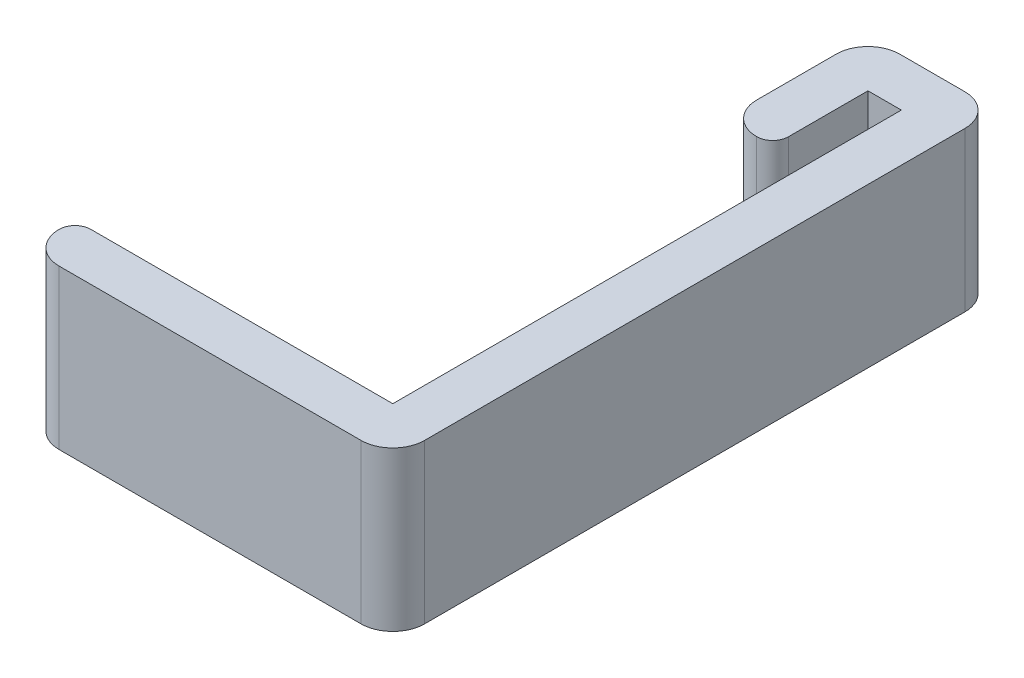
ISO-10303-21;
HEADER;
FILE_DESCRIPTION(('STEP AP214'),'2;1');
FILE_NAME('part.step','',(''),(''),'','','');
FILE_SCHEMA(('AUTOMOTIVE_DESIGN { 1 0 10303 214 1 1 1 1 }'));
ENDSEC;
DATA;
#1=APPLICATION_CONTEXT('core data for automotive mechanical design processes');
#2=APPLICATION_PROTOCOL_DEFINITION('international standard','automotive_design',2000,#1);
#3=PRODUCT_CONTEXT('',#1,'mechanical');
#4=PRODUCT('Part','Part','',(#3));
#5=PRODUCT_RELATED_PRODUCT_CATEGORY('part','',(#4));
#6=PRODUCT_DEFINITION_FORMATION('','',#4);
#7=PRODUCT_DEFINITION_CONTEXT('part definition',#1,'design');
#8=PRODUCT_DEFINITION('design','',#6,#7);
#9=PRODUCT_DEFINITION_SHAPE('','',#8);
#10=(LENGTH_UNIT() NAMED_UNIT(*) SI_UNIT(.MILLI.,.METRE.));
#11=(NAMED_UNIT(*) PLANE_ANGLE_UNIT() SI_UNIT($,.RADIAN.));
#12=(NAMED_UNIT(*) SI_UNIT($,.STERADIAN.) SOLID_ANGLE_UNIT());
#13=UNCERTAINTY_MEASURE_WITH_UNIT(LENGTH_MEASURE(1.E-05),#10,'distance_accuracy_value','');
#14=(GEOMETRIC_REPRESENTATION_CONTEXT(3) GLOBAL_UNCERTAINTY_ASSIGNED_CONTEXT((#13)) GLOBAL_UNIT_ASSIGNED_CONTEXT((#10,
#11,#12)) REPRESENTATION_CONTEXT('',''));
#15=CARTESIAN_POINT('',(0.,0.,0.));
#16=DIRECTION('',(0.,0.,1.));
#17=DIRECTION('',(1.,0.,0.));
#18=AXIS2_PLACEMENT_3D('',#15,#16,#17);
#19=CARTESIAN_POINT('',(-1.,10.,-1.));
#20=DIRECTION('',(0.,1.,0.));
#21=DIRECTION('',(0.,0.,1.));
#22=AXIS2_PLACEMENT_3D('',#19,#20,#21);
#23=CYLINDRICAL_SURFACE('',#22,1.);
#24=DIRECTION('',(0.,-1.,0.));
#25=VECTOR('',#24,1.);
#26=CARTESIAN_POINT('',(-1.,10.,0.));
#27=LINE('',#26,#25);
#28=CARTESIAN_POINT('',(-1.,10.,0.));
#29=VERTEX_POINT('',#28);
#30=CARTESIAN_POINT('',(-1.,0.,0.));
#31=VERTEX_POINT('',#30);
#32=EDGE_CURVE('E243',#29,#31,#27,.T.);
#33=ORIENTED_EDGE('',*,*,#32,.T.);
#34=CARTESIAN_POINT('',(-1.,0.,-1.));
#35=DIRECTION('',(0.,1.,0.));
#36=DIRECTION('',(0.,0.,1.));
#37=AXIS2_PLACEMENT_3D('',#34,#35,#36);
#38=CIRCLE('',#37,1.);
#39=CARTESIAN_POINT('',(0.,0.,-1.));
#40=VERTEX_POINT('',#39);
#41=EDGE_CURVE('E40',#40,#31,#38,.F.);
#42=ORIENTED_EDGE('',*,*,#41,.F.);
#43=DIRECTION('',(0.,1.,0.));
#44=VECTOR('',#43,1.);
#45=CARTESIAN_POINT('',(0.,10.,-1.));
#46=LINE('',#45,#44);
#47=CARTESIAN_POINT('',(0.,10.,-1.));
#48=VERTEX_POINT('',#47);
#49=EDGE_CURVE('E252',#48,#40,#46,.F.);
#50=ORIENTED_EDGE('',*,*,#49,.F.);
#51=CARTESIAN_POINT('',(-1.,10.,-1.));
#52=DIRECTION('',(0.,1.,0.));
#53=DIRECTION('',(0.,0.,1.));
#54=AXIS2_PLACEMENT_3D('',#51,#52,#53);
#55=CIRCLE('',#54,1.);
#56=EDGE_CURVE('E11',#29,#48,#55,.T.);
#57=ORIENTED_EDGE('',*,*,#56,.F.);
#58=EDGE_LOOP('',(#33,#42,#50,#57));
#59=FACE_BOUND('',#58,.T.);
#60=ADVANCED_FACE('F33',(#59),#23,.T.);
#61=CARTESIAN_POINT('',(-1.,10.,-2.));
#62=DIRECTION('',(0.,-1.,0.));
#63=DIRECTION('',(0.,0.,-1.));
#64=AXIS2_PLACEMENT_3D('',#61,#62,#63);
#65=CYLINDRICAL_SURFACE('',#64,2.);
#66=ORIENTED_EDGE('',*,*,#32,.F.);
#67=CARTESIAN_POINT('',(-1.,10.,-2.));
#68=DIRECTION('',(0.,1.,0.));
#69=DIRECTION('',(0.,0.,1.));
#70=AXIS2_PLACEMENT_3D('',#67,#68,#69);
#71=CIRCLE('',#70,2.);
#72=CARTESIAN_POINT('',(-3.,10.,-2.));
#73=VERTEX_POINT('',#72);
#74=EDGE_CURVE('E248',#73,#29,#71,.T.);
#75=ORIENTED_EDGE('',*,*,#74,.F.);
#76=DIRECTION('',(0.,-1.,0.));
#77=VECTOR('',#76,1.);
#78=CARTESIAN_POINT('',(-3.,10.,-2.));
#79=LINE('',#78,#77);
#80=CARTESIAN_POINT('',(-3.,0.,-2.));
#81=VERTEX_POINT('',#80);
#82=EDGE_CURVE('E245',#81,#73,#79,.F.);
#83=ORIENTED_EDGE('',*,*,#82,.F.);
#84=CARTESIAN_POINT('',(-1.,0.,-2.));
#85=DIRECTION('',(0.,1.,0.));
#86=DIRECTION('',(0.,0.,1.));
#87=AXIS2_PLACEMENT_3D('',#84,#85,#86);
#88=CIRCLE('',#87,2.);
#89=EDGE_CURVE('E250',#31,#81,#88,.F.);
#90=ORIENTED_EDGE('',*,*,#89,.F.);
#91=EDGE_LOOP('',(#66,#75,#83,#90));
#92=FACE_BOUND('',#91,.T.);
#93=ADVANCED_FACE('F260',(#92),#65,.T.);
#94=CARTESIAN_POINT('',(-16.9,10.,27.));
#95=DIRECTION('',(0.,-1.,0.));
#96=DIRECTION('',(0.,0.,-1.));
#97=AXIS2_PLACEMENT_3D('',#94,#95,#96);
#98=CYLINDRICAL_SURFACE('',#97,1.);
#99=DIRECTION('',(0.,-1.,0.));
#100=VECTOR('',#99,1.);
#101=CARTESIAN_POINT('',(-17.9,10.,27.));
#102=LINE('',#101,#100);
#103=CARTESIAN_POINT('',(-17.9,0.,27.));
#104=VERTEX_POINT('',#103);
#105=CARTESIAN_POINT('',(-17.9,10.,27.));
#106=VERTEX_POINT('',#105);
#107=EDGE_CURVE('E218',#104,#106,#102,.F.);
#108=ORIENTED_EDGE('',*,*,#107,.T.);
#109=CARTESIAN_POINT('',(-16.9,10.,27.));
#110=DIRECTION('',(0.,1.,0.));
#111=DIRECTION('',(0.,0.,1.));
#112=AXIS2_PLACEMENT_3D('',#109,#110,#111);
#113=CIRCLE('',#112,1.);
#114=CARTESIAN_POINT('',(-16.9,10.,26.));
#115=VERTEX_POINT('',#114);
#116=EDGE_CURVE('E239',#115,#106,#113,.T.);
#117=ORIENTED_EDGE('',*,*,#116,.F.);
#118=DIRECTION('',(0.,-1.,0.));
#119=VECTOR('',#118,1.);
#120=CARTESIAN_POINT('',(-16.9,10.,26.));
#121=LINE('',#120,#119);
#122=CARTESIAN_POINT('',(-16.9,0.,26.));
#123=VERTEX_POINT('',#122);
#124=EDGE_CURVE('E236',#123,#115,#121,.F.);
#125=ORIENTED_EDGE('',*,*,#124,.F.);
#126=CARTESIAN_POINT('',(-16.9,0.,27.));
#127=DIRECTION('',(0.,1.,0.));
#128=DIRECTION('',(0.,0.,1.));
#129=AXIS2_PLACEMENT_3D('',#126,#127,#128);
#130=CIRCLE('',#129,1.);
#131=EDGE_CURVE('E241',#104,#123,#130,.F.);
#132=ORIENTED_EDGE('',*,*,#131,.F.);
#133=EDGE_LOOP('',(#108,#117,#125,#132));
#134=FACE_BOUND('',#133,.T.);
#135=ADVANCED_FACE('F298',(#134),#98,.T.);
#136=CARTESIAN_POINT('',(-1.,10.,-7.));
#137=DIRECTION('',(0.,-1.,0.));
#138=DIRECTION('',(0.,0.,-1.));
#139=AXIS2_PLACEMENT_3D('',#136,#137,#138);
#140=CYLINDRICAL_SURFACE('',#139,2.);
#141=DIRECTION('',(0.,-1.,0.));
#142=VECTOR('',#141,1.);
#143=CARTESIAN_POINT('',(-3.,10.,-7.));
#144=LINE('',#143,#142);
#145=CARTESIAN_POINT('',(-3.,10.,-7.));
#146=VERTEX_POINT('',#145);
#147=CARTESIAN_POINT('',(-3.,0.,-7.));
#148=VERTEX_POINT('',#147);
#149=EDGE_CURVE('E226',#146,#148,#144,.T.);
#150=ORIENTED_EDGE('',*,*,#149,.F.);
#151=CARTESIAN_POINT('',(-1.,10.,-7.));
#152=DIRECTION('',(0.,1.,0.));
#153=DIRECTION('',(0.,0.,1.));
#154=AXIS2_PLACEMENT_3D('',#151,#152,#153);
#155=CIRCLE('',#154,2.);
#156=CARTESIAN_POINT('',(-1.,10.,-9.));
#157=VERTEX_POINT('',#156);
#158=EDGE_CURVE('E232',#157,#146,#155,.T.);
#159=ORIENTED_EDGE('',*,*,#158,.F.);
#160=DIRECTION('',(0.,-1.,0.));
#161=VECTOR('',#160,1.);
#162=CARTESIAN_POINT('',(-1.,10.,-9.));
#163=LINE('',#162,#161);
#164=CARTESIAN_POINT('',(-1.,0.,-9.));
#165=VERTEX_POINT('',#164);
#166=EDGE_CURVE('E229',#165,#157,#163,.F.);
#167=ORIENTED_EDGE('',*,*,#166,.F.);
#168=CARTESIAN_POINT('',(-1.,0.,-7.));
#169=DIRECTION('',(0.,1.,0.));
#170=DIRECTION('',(0.,0.,1.));
#171=AXIS2_PLACEMENT_3D('',#168,#169,#170);
#172=CIRCLE('',#171,2.);
#173=EDGE_CURVE('E234',#148,#165,#172,.F.);
#174=ORIENTED_EDGE('',*,*,#173,.F.);
#175=EDGE_LOOP('',(#150,#159,#167,#174));
#176=FACE_BOUND('',#175,.T.);
#177=ADVANCED_FACE('F268',(#176),#140,.T.);
#178=CARTESIAN_POINT('',(-15.9,10.,27.));
#179=DIRECTION('',(0.,-1.,0.));
#180=DIRECTION('',(0.,0.,-1.));
#181=AXIS2_PLACEMENT_3D('',#178,#179,#180);
#182=CYLINDRICAL_SURFACE('',#181,2.);
#183=DIRECTION('',(0.,-1.,0.));
#184=VECTOR('',#183,1.);
#185=CARTESIAN_POINT('',(-15.9,10.,29.));
#186=LINE('',#185,#184);
#187=CARTESIAN_POINT('',(-15.9,10.,29.));
#188=VERTEX_POINT('',#187);
#189=CARTESIAN_POINT('',(-15.9,0.,29.));
#190=VERTEX_POINT('',#189);
#191=EDGE_CURVE('E215',#188,#190,#186,.T.);
#192=ORIENTED_EDGE('',*,*,#191,.F.);
#193=CARTESIAN_POINT('',(-15.9,10.,27.));
#194=DIRECTION('',(0.,1.,0.));
#195=DIRECTION('',(0.,0.,1.));
#196=AXIS2_PLACEMENT_3D('',#193,#194,#195);
#197=CIRCLE('',#196,2.);
#198=EDGE_CURVE('E221',#106,#188,#197,.T.);
#199=ORIENTED_EDGE('',*,*,#198,.F.);
#200=ORIENTED_EDGE('',*,*,#107,.F.);
#201=CARTESIAN_POINT('',(-15.9,0.,27.));
#202=DIRECTION('',(0.,1.,0.));
#203=DIRECTION('',(0.,0.,1.));
#204=AXIS2_PLACEMENT_3D('',#201,#202,#203);
#205=CIRCLE('',#204,2.);
#206=EDGE_CURVE('E223',#190,#104,#205,.F.);
#207=ORIENTED_EDGE('',*,*,#206,.F.);
#208=EDGE_LOOP('',(#192,#199,#200,#207));
#209=FACE_BOUND('',#208,.T.);
#210=ADVANCED_FACE('F296',(#209),#182,.T.);
#211=CARTESIAN_POINT('',(3.1,10.,27.));
#212=DIRECTION('',(0.,1.,0.));
#213=DIRECTION('',(0.,0.,1.));
#214=AXIS2_PLACEMENT_3D('',#211,#212,#213);
#215=CYLINDRICAL_SURFACE('',#214,2.);
#216=DIRECTION('',(0.,1.,0.));
#217=VECTOR('',#216,1.);
#218=CARTESIAN_POINT('',(3.1,10.,29.));
#219=LINE('',#218,#217);
#220=CARTESIAN_POINT('',(3.1,0.,29.));
#221=VERTEX_POINT('',#220);
#222=CARTESIAN_POINT('',(3.1,10.,29.));
#223=VERTEX_POINT('',#222);
#224=EDGE_CURVE('E204',#221,#223,#219,.T.);
#225=ORIENTED_EDGE('',*,*,#224,.F.);
#226=CARTESIAN_POINT('',(3.1,0.,27.));
#227=DIRECTION('',(0.,1.,0.));
#228=DIRECTION('',(0.,0.,1.));
#229=AXIS2_PLACEMENT_3D('',#226,#227,#228);
#230=CIRCLE('',#229,2.);
#231=CARTESIAN_POINT('',(5.1,0.,27.));
#232=VERTEX_POINT('',#231);
#233=EDGE_CURVE('E210',#232,#221,#230,.F.);
#234=ORIENTED_EDGE('',*,*,#233,.F.);
#235=DIRECTION('',(0.,1.,0.));
#236=VECTOR('',#235,1.);
#237=CARTESIAN_POINT('',(5.1,10.,27.));
#238=LINE('',#237,#236);
#239=CARTESIAN_POINT('',(5.1,10.,27.));
#240=VERTEX_POINT('',#239);
#241=EDGE_CURVE('E207',#240,#232,#238,.F.);
#242=ORIENTED_EDGE('',*,*,#241,.F.);
#243=CARTESIAN_POINT('',(3.1,10.,27.));
#244=DIRECTION('',(0.,1.,0.));
#245=DIRECTION('',(0.,0.,1.));
#246=AXIS2_PLACEMENT_3D('',#243,#244,#245);
#247=CIRCLE('',#246,2.);
#248=EDGE_CURVE('E213',#223,#240,#247,.T.);
#249=ORIENTED_EDGE('',*,*,#248,.F.);
#250=EDGE_LOOP('',(#225,#234,#242,#249));
#251=FACE_BOUND('',#250,.T.);
#252=ADVANCED_FACE('F286',(#251),#215,.T.);
#253=CARTESIAN_POINT('',(3.1,10.,-7.));
#254=DIRECTION('',(0.,-1.,0.));
#255=DIRECTION('',(0.,0.,-1.));
#256=AXIS2_PLACEMENT_3D('',#253,#254,#255);
#257=CYLINDRICAL_SURFACE('',#256,2.);
#258=DIRECTION('',(0.,-1.,0.));
#259=VECTOR('',#258,1.);
#260=CARTESIAN_POINT('',(3.1,10.,-9.));
#261=LINE('',#260,#259);
#262=CARTESIAN_POINT('',(3.1,10.,-9.));
#263=VERTEX_POINT('',#262);
#264=CARTESIAN_POINT('',(3.1,0.,-9.));
#265=VERTEX_POINT('',#264);
#266=EDGE_CURVE('E150',#263,#265,#261,.T.);
#267=ORIENTED_EDGE('',*,*,#266,.F.);
#268=CARTESIAN_POINT('',(3.1,10.,-7.));
#269=DIRECTION('',(0.,1.,0.));
#270=DIRECTION('',(0.,0.,1.));
#271=AXIS2_PLACEMENT_3D('',#268,#269,#270);
#272=CIRCLE('',#271,2.);
#273=CARTESIAN_POINT('',(5.1,10.,-7.));
#274=VERTEX_POINT('',#273);
#275=EDGE_CURVE('E199',#274,#263,#272,.T.);
#276=ORIENTED_EDGE('',*,*,#275,.F.);
#277=DIRECTION('',(0.,-1.,0.));
#278=VECTOR('',#277,1.);
#279=CARTESIAN_POINT('',(5.1,10.,-7.));
#280=LINE('',#279,#278);
#281=CARTESIAN_POINT('',(5.1,0.,-7.));
#282=VERTEX_POINT('',#281);
#283=EDGE_CURVE('E196',#282,#274,#280,.F.);
#284=ORIENTED_EDGE('',*,*,#283,.F.);
#285=CARTESIAN_POINT('',(3.1,0.,-7.));
#286=DIRECTION('',(0.,1.,0.));
#287=DIRECTION('',(0.,0.,1.));
#288=AXIS2_PLACEMENT_3D('',#285,#286,#287);
#289=CIRCLE('',#288,2.);
#290=EDGE_CURVE('E201',#265,#282,#289,.F.);
#291=ORIENTED_EDGE('',*,*,#290,.F.);
#292=EDGE_LOOP('',(#267,#276,#284,#291));
#293=FACE_BOUND('',#292,.T.);
#294=ADVANCED_FACE('F275',(#293),#257,.T.);
#295=CARTESIAN_POINT('',(0.,10.,0.));
#296=DIRECTION('',(-1.,0.,0.));
#297=DIRECTION('',(0.,0.,1.));
#298=AXIS2_PLACEMENT_3D('',#295,#296,#297);
#299=PLANE('',#298);
#300=DIRECTION('',(0.,0.,-1.));
#301=VECTOR('',#300,1.);
#302=CARTESIAN_POINT('',(0.,10.,0.));
#303=LINE('',#302,#301);
#304=CARTESIAN_POINT('',(0.,10.,-6.));
#305=VERTEX_POINT('',#304);
#306=EDGE_CURVE('E134',#48,#305,#303,.T.);
#307=ORIENTED_EDGE('',*,*,#306,.F.);
#308=ORIENTED_EDGE('',*,*,#49,.T.);
#309=DIRECTION('',(0.,0.,-1.));
#310=VECTOR('',#309,1.);
#311=CARTESIAN_POINT('',(0.,0.,0.));
#312=LINE('',#311,#310);
#313=CARTESIAN_POINT('',(0.,0.,-6.));
#314=VERTEX_POINT('',#313);
#315=EDGE_CURVE('E147',#40,#314,#312,.T.);
#316=ORIENTED_EDGE('',*,*,#315,.T.);
#317=DIRECTION('',(0.,-1.,0.));
#318=VECTOR('',#317,1.);
#319=CARTESIAN_POINT('',(0.,10.,-6.));
#320=LINE('',#319,#318);
#321=EDGE_CURVE('E144',#305,#314,#320,.T.);
#322=ORIENTED_EDGE('',*,*,#321,.F.);
#323=EDGE_LOOP('',(#307,#308,#316,#322));
#324=FACE_BOUND('',#323,.T.);
#325=ADVANCED_FACE('F145',(#324),#299,.F.);
#326=CARTESIAN_POINT('',(0.,10.,-6.));
#327=DIRECTION('',(0.,0.,-1.));
#328=DIRECTION('',(-1.,0.,0.));
#329=AXIS2_PLACEMENT_3D('',#326,#327,#328);
#330=PLANE('',#329);
#331=DIRECTION('',(1.,0.,0.));
#332=VECTOR('',#331,1.);
#333=CARTESIAN_POINT('',(0.,0.,-6.));
#334=LINE('',#333,#332);
#335=CARTESIAN_POINT('',(2.1,0.,-6.));
#336=VERTEX_POINT('',#335);
#337=EDGE_CURVE('E175',#314,#336,#334,.T.);
#338=ORIENTED_EDGE('',*,*,#337,.T.);
#339=DIRECTION('',(0.,-1.,0.));
#340=VECTOR('',#339,1.);
#341=CARTESIAN_POINT('',(2.1,10.,-6.));
#342=LINE('',#341,#340);
#343=CARTESIAN_POINT('',(2.1,10.,-6.));
#344=VERTEX_POINT('',#343);
#345=EDGE_CURVE('E151',#344,#336,#342,.T.);
#346=ORIENTED_EDGE('',*,*,#345,.F.);
#347=DIRECTION('',(1.,0.,0.));
#348=VECTOR('',#347,1.);
#349=CARTESIAN_POINT('',(0.,10.,-6.));
#350=LINE('',#349,#348);
#351=EDGE_CURVE('E138',#305,#344,#350,.T.);
#352=ORIENTED_EDGE('',*,*,#351,.F.);
#353=ORIENTED_EDGE('',*,*,#321,.T.);
#354=EDGE_LOOP('',(#338,#346,#352,#353));
#355=FACE_BOUND('',#354,.T.);
#356=ADVANCED_FACE('F153',(#355),#330,.F.);
#357=CARTESIAN_POINT('',(2.1,10.,-6.));
#358=DIRECTION('',(1.,0.,0.));
#359=DIRECTION('',(0.,0.,-1.));
#360=AXIS2_PLACEMENT_3D('',#357,#358,#359);
#361=PLANE('',#360);
#362=DIRECTION('',(0.,0.,1.));
#363=VECTOR('',#362,1.);
#364=CARTESIAN_POINT('',(2.1,0.,-6.));
#365=LINE('',#364,#363);
#366=CARTESIAN_POINT('',(2.1,0.,26.));
#367=VERTEX_POINT('',#366);
#368=EDGE_CURVE('E177',#336,#367,#365,.T.);
#369=ORIENTED_EDGE('',*,*,#368,.T.);
#370=DIRECTION('',(0.,-1.,0.));
#371=VECTOR('',#370,1.);
#372=CARTESIAN_POINT('',(2.1,10.,26.));
#373=LINE('',#372,#371);
#374=CARTESIAN_POINT('',(2.1,10.,26.));
#375=VERTEX_POINT('',#374);
#376=EDGE_CURVE('E173',#375,#367,#373,.T.);
#377=ORIENTED_EDGE('',*,*,#376,.F.);
#378=DIRECTION('',(0.,0.,1.));
#379=VECTOR('',#378,1.);
#380=CARTESIAN_POINT('',(2.1,10.,-6.));
#381=LINE('',#380,#379);
#382=EDGE_CURVE('E156',#344,#375,#381,.T.);
#383=ORIENTED_EDGE('',*,*,#382,.F.);
#384=ORIENTED_EDGE('',*,*,#345,.T.);
#385=EDGE_LOOP('',(#369,#377,#383,#384));
#386=FACE_BOUND('',#385,.T.);
#387=ADVANCED_FACE('F305',(#386),#361,.F.);
#388=CARTESIAN_POINT('',(2.1,10.,26.));
#389=DIRECTION('',(0.,0.,1.));
#390=DIRECTION('',(1.,0.,0.));
#391=AXIS2_PLACEMENT_3D('',#388,#389,#390);
#392=PLANE('',#391);
#393=DIRECTION('',(-1.,0.,0.));
#394=VECTOR('',#393,1.);
#395=CARTESIAN_POINT('',(2.1,0.,26.));
#396=LINE('',#395,#394);
#397=EDGE_CURVE('E179',#367,#123,#396,.T.);
#398=ORIENTED_EDGE('',*,*,#397,.T.);
#399=ORIENTED_EDGE('',*,*,#124,.T.);
#400=DIRECTION('',(-1.,0.,0.));
#401=VECTOR('',#400,1.);
#402=CARTESIAN_POINT('',(2.1,10.,26.));
#403=LINE('',#402,#401);
#404=EDGE_CURVE('E158',#375,#115,#403,.T.);
#405=ORIENTED_EDGE('',*,*,#404,.F.);
#406=ORIENTED_EDGE('',*,*,#376,.T.);
#407=EDGE_LOOP('',(#398,#399,#405,#406));
#408=FACE_BOUND('',#407,.T.);
#409=ADVANCED_FACE('F301',(#408),#392,.F.);
#410=CARTESIAN_POINT('',(-17.9,10.,29.));
#411=DIRECTION('',(0.,0.,-1.));
#412=DIRECTION('',(-1.,0.,0.));
#413=AXIS2_PLACEMENT_3D('',#410,#411,#412);
#414=PLANE('',#413);
#415=DIRECTION('',(1.,0.,0.));
#416=VECTOR('',#415,1.);
#417=CARTESIAN_POINT('',(-17.9,10.,29.));
#418=LINE('',#417,#416);
#419=EDGE_CURVE('E163',#188,#223,#418,.T.);
#420=ORIENTED_EDGE('',*,*,#419,.F.);
#421=ORIENTED_EDGE('',*,*,#191,.T.);
#422=DIRECTION('',(1.,0.,0.));
#423=VECTOR('',#422,1.);
#424=CARTESIAN_POINT('',(-17.9,0.,29.));
#425=LINE('',#424,#423);
#426=EDGE_CURVE('E182',#190,#221,#425,.T.);
#427=ORIENTED_EDGE('',*,*,#426,.T.);
#428=ORIENTED_EDGE('',*,*,#224,.T.);
#429=EDGE_LOOP('',(#420,#421,#427,#428));
#430=FACE_BOUND('',#429,.T.);
#431=ADVANCED_FACE('F289',(#430),#414,.F.);
#432=CARTESIAN_POINT('',(5.1,10.,29.));
#433=DIRECTION('',(-1.,0.,0.));
#434=DIRECTION('',(0.,0.,1.));
#435=AXIS2_PLACEMENT_3D('',#432,#433,#434);
#436=PLANE('',#435);
#437=DIRECTION('',(0.,0.,-1.));
#438=VECTOR('',#437,1.);
#439=CARTESIAN_POINT('',(5.1,10.,29.));
#440=LINE('',#439,#438);
#441=EDGE_CURVE('E165',#240,#274,#440,.T.);
#442=ORIENTED_EDGE('',*,*,#441,.F.);
#443=ORIENTED_EDGE('',*,*,#241,.T.);
#444=DIRECTION('',(0.,0.,-1.));
#445=VECTOR('',#444,1.);
#446=CARTESIAN_POINT('',(5.1,0.,29.));
#447=LINE('',#446,#445);
#448=EDGE_CURVE('E184',#232,#282,#447,.T.);
#449=ORIENTED_EDGE('',*,*,#448,.T.);
#450=ORIENTED_EDGE('',*,*,#283,.T.);
#451=EDGE_LOOP('',(#442,#443,#449,#450));
#452=FACE_BOUND('',#451,.T.);
#453=ADVANCED_FACE('F282',(#452),#436,.F.);
#454=CARTESIAN_POINT('',(5.1,10.,-9.));
#455=DIRECTION('',(0.,0.,1.));
#456=DIRECTION('',(1.,0.,0.));
#457=AXIS2_PLACEMENT_3D('',#454,#455,#456);
#458=PLANE('',#457);
#459=DIRECTION('',(-1.,0.,0.));
#460=VECTOR('',#459,1.);
#461=CARTESIAN_POINT('',(5.1,0.,-9.));
#462=LINE('',#461,#460);
#463=EDGE_CURVE('E186',#265,#165,#462,.T.);
#464=ORIENTED_EDGE('',*,*,#463,.T.);
#465=ORIENTED_EDGE('',*,*,#166,.T.);
#466=DIRECTION('',(-1.,0.,0.));
#467=VECTOR('',#466,1.);
#468=CARTESIAN_POINT('',(5.1,10.,-9.));
#469=LINE('',#468,#467);
#470=EDGE_CURVE('E167',#263,#157,#469,.T.);
#471=ORIENTED_EDGE('',*,*,#470,.F.);
#472=ORIENTED_EDGE('',*,*,#266,.T.);
#473=EDGE_LOOP('',(#464,#465,#471,#472));
#474=FACE_BOUND('',#473,.T.);
#475=ADVANCED_FACE('F271',(#474),#458,.F.);
#476=CARTESIAN_POINT('',(-3.,10.,-9.));
#477=DIRECTION('',(1.,0.,0.));
#478=DIRECTION('',(0.,0.,-1.));
#479=AXIS2_PLACEMENT_3D('',#476,#477,#478);
#480=PLANE('',#479);
#481=DIRECTION('',(0.,0.,1.));
#482=VECTOR('',#481,1.);
#483=CARTESIAN_POINT('',(-3.,0.,-9.));
#484=LINE('',#483,#482);
#485=EDGE_CURVE('E141',#148,#81,#484,.T.);
#486=ORIENTED_EDGE('',*,*,#485,.T.);
#487=ORIENTED_EDGE('',*,*,#82,.T.);
#488=DIRECTION('',(0.,0.,1.));
#489=VECTOR('',#488,1.);
#490=CARTESIAN_POINT('',(-3.,10.,-9.));
#491=LINE('',#490,#489);
#492=EDGE_CURVE('E170',#146,#73,#491,.T.);
#493=ORIENTED_EDGE('',*,*,#492,.F.);
#494=ORIENTED_EDGE('',*,*,#149,.T.);
#495=EDGE_LOOP('',(#486,#487,#493,#494));
#496=FACE_BOUND('',#495,.T.);
#497=ADVANCED_FACE('F263',(#496),#480,.F.);
#498=CARTESIAN_POINT('',(0.,10.,0.));
#499=DIRECTION('',(0.,1.,0.));
#500=DIRECTION('',(0.,0.,1.));
#501=AXIS2_PLACEMENT_3D('',#498,#499,#500);
#502=PLANE('',#501);
#503=ORIENTED_EDGE('',*,*,#74,.T.);
#504=ORIENTED_EDGE('',*,*,#56,.T.);
#505=ORIENTED_EDGE('',*,*,#306,.T.);
#506=ORIENTED_EDGE('',*,*,#351,.T.);
#507=ORIENTED_EDGE('',*,*,#382,.T.);
#508=ORIENTED_EDGE('',*,*,#404,.T.);
#509=ORIENTED_EDGE('',*,*,#116,.T.);
#510=ORIENTED_EDGE('',*,*,#198,.T.);
#511=ORIENTED_EDGE('',*,*,#419,.T.);
#512=ORIENTED_EDGE('',*,*,#248,.T.);
#513=ORIENTED_EDGE('',*,*,#441,.T.);
#514=ORIENTED_EDGE('',*,*,#275,.T.);
#515=ORIENTED_EDGE('',*,*,#470,.T.);
#516=ORIENTED_EDGE('',*,*,#158,.T.);
#517=ORIENTED_EDGE('',*,*,#492,.T.);
#518=EDGE_LOOP('',(#503,#504,#505,#506,#507,#508,#509,#510,#511,#512,#513,#514,#515,#516,#517));
#519=FACE_BOUND('',#518,.T.);
#520=ADVANCED_FACE('F136',(#519),#502,.T.);
#521=CARTESIAN_POINT('',(0.,0.,0.));
#522=DIRECTION('',(0.,1.,0.));
#523=DIRECTION('',(0.,0.,1.));
#524=AXIS2_PLACEMENT_3D('',#521,#522,#523);
#525=PLANE('',#524);
#526=ORIENTED_EDGE('',*,*,#315,.F.);
#527=ORIENTED_EDGE('',*,*,#41,.T.);
#528=ORIENTED_EDGE('',*,*,#89,.T.);
#529=ORIENTED_EDGE('',*,*,#485,.F.);
#530=ORIENTED_EDGE('',*,*,#173,.T.);
#531=ORIENTED_EDGE('',*,*,#463,.F.);
#532=ORIENTED_EDGE('',*,*,#290,.T.);
#533=ORIENTED_EDGE('',*,*,#448,.F.);
#534=ORIENTED_EDGE('',*,*,#233,.T.);
#535=ORIENTED_EDGE('',*,*,#426,.F.);
#536=ORIENTED_EDGE('',*,*,#206,.T.);
#537=ORIENTED_EDGE('',*,*,#131,.T.);
#538=ORIENTED_EDGE('',*,*,#397,.F.);
#539=ORIENTED_EDGE('',*,*,#368,.F.);
#540=ORIENTED_EDGE('',*,*,#337,.F.);
#541=EDGE_LOOP('',(#526,#527,#528,#529,#530,#531,#532,#533,#534,#535,#536,#537,#538,#539,#540));
#542=FACE_BOUND('',#541,.T.);
#543=ADVANCED_FACE('F255',(#542),#525,.F.);
#544=CLOSED_SHELL('',(#60,#93,#135,#177,#210,#252,#294,#325,#356,#387,#409,#431,#453,#475,#497,
#520,#543));
#545=MANIFOLD_SOLID_BREP('B2',#544);
#546=ADVANCED_BREP_SHAPE_REPRESENTATION('',(#18,#545),#14);
#547=SHAPE_DEFINITION_REPRESENTATION(#9,#546);
ENDSEC;
END-ISO-10303-21;
